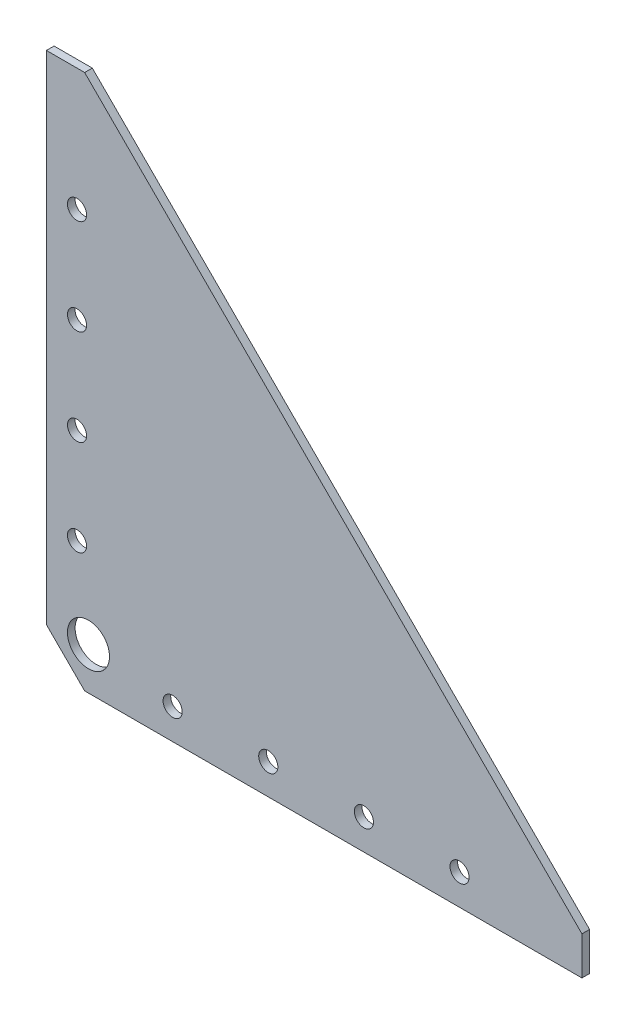
ISO-10303-21;
HEADER;
FILE_DESCRIPTION(('STEP AP214'),'2;1');
FILE_NAME('part.step','',(''),(''),'','','');
FILE_SCHEMA(('AUTOMOTIVE_DESIGN { 1 0 10303 214 1 1 1 1 }'));
ENDSEC;
DATA;
#1=APPLICATION_CONTEXT('core data for automotive mechanical design processes');
#2=APPLICATION_PROTOCOL_DEFINITION('international standard','automotive_design',2000,#1);
#3=PRODUCT_CONTEXT('',#1,'mechanical');
#4=PRODUCT('Part','Part','',(#3));
#5=PRODUCT_RELATED_PRODUCT_CATEGORY('part','',(#4));
#6=PRODUCT_DEFINITION_FORMATION('','',#4);
#7=PRODUCT_DEFINITION_CONTEXT('part definition',#1,'design');
#8=PRODUCT_DEFINITION('design','',#6,#7);
#9=PRODUCT_DEFINITION_SHAPE('','',#8);
#10=(LENGTH_UNIT() NAMED_UNIT(*) SI_UNIT(.MILLI.,.METRE.));
#11=(NAMED_UNIT(*) PLANE_ANGLE_UNIT() SI_UNIT($,.RADIAN.));
#12=(NAMED_UNIT(*) SI_UNIT($,.STERADIAN.) SOLID_ANGLE_UNIT());
#13=UNCERTAINTY_MEASURE_WITH_UNIT(LENGTH_MEASURE(1.E-05),#10,'distance_accuracy_value','');
#14=(GEOMETRIC_REPRESENTATION_CONTEXT(3) GLOBAL_UNCERTAINTY_ASSIGNED_CONTEXT((#13)) GLOBAL_UNIT_ASSIGNED_CONTEXT((#10,
#11,#12)) REPRESENTATION_CONTEXT('',''));
#15=CARTESIAN_POINT('',(0.,0.,0.));
#16=DIRECTION('',(0.,0.,1.));
#17=DIRECTION('',(1.,0.,0.));
#18=AXIS2_PLACEMENT_3D('',#15,#16,#17);
#19=CARTESIAN_POINT('',(0.,140.,-2.));
#20=DIRECTION('',(-1.,0.,0.));
#21=DIRECTION('',(0.,-1.,0.));
#22=AXIS2_PLACEMENT_3D('',#19,#20,#21);
#23=PLANE('',#22);
#24=DIRECTION('',(0.,-1.,0.));
#25=VECTOR('',#24,1.);
#26=CARTESIAN_POINT('',(0.,140.,-2.));
#27=LINE('',#26,#25);
#28=CARTESIAN_POINT('',(0.,140.,-2.));
#29=VERTEX_POINT('',#28);
#30=CARTESIAN_POINT('',(0.,9.99999999999999,-2.));
#31=VERTEX_POINT('',#30);
#32=EDGE_CURVE('E126',#29,#31,#27,.T.);
#33=ORIENTED_EDGE('',*,*,#32,.T.);
#34=DIRECTION('',(0.,0.,1.));
#35=VECTOR('',#34,1.);
#36=CARTESIAN_POINT('',(0.,9.99999999999999,-2.));
#37=LINE('',#36,#35);
#38=CARTESIAN_POINT('',(0.,9.99999999999999,0.));
#39=VERTEX_POINT('',#38);
#40=EDGE_CURVE('E116',#31,#39,#37,.T.);
#41=ORIENTED_EDGE('',*,*,#40,.T.);
#42=DIRECTION('',(0.,-1.,0.));
#43=VECTOR('',#42,1.);
#44=CARTESIAN_POINT('',(0.,140.,0.));
#45=LINE('',#44,#43);
#46=CARTESIAN_POINT('',(0.,140.,0.));
#47=VERTEX_POINT('',#46);
#48=EDGE_CURVE('E145',#47,#39,#45,.T.);
#49=ORIENTED_EDGE('',*,*,#48,.F.);
#50=DIRECTION('',(0.,0.,1.));
#51=VECTOR('',#50,1.);
#52=CARTESIAN_POINT('',(0.,140.,-2.));
#53=LINE('',#52,#51);
#54=EDGE_CURVE('E12',#29,#47,#53,.T.);
#55=ORIENTED_EDGE('',*,*,#54,.F.);
#56=EDGE_LOOP('',(#33,#41,#49,#55));
#57=FACE_BOUND('',#56,.T.);
#58=ADVANCED_FACE('F57',(#57),#23,.T.);
#59=CARTESIAN_POINT('',(0.,0.,-2.));
#60=DIRECTION('',(0.,-1.,0.));
#61=DIRECTION('',(0.,0.,-1.));
#62=AXIS2_PLACEMENT_3D('',#59,#60,#61);
#63=PLANE('',#62);
#64=DIRECTION('',(1.,0.,0.));
#65=VECTOR('',#64,1.);
#66=CARTESIAN_POINT('',(0.,0.,0.));
#67=LINE('',#66,#65);
#68=CARTESIAN_POINT('',(10.,0.,0.));
#69=VERTEX_POINT('',#68);
#70=CARTESIAN_POINT('',(140.,0.,0.));
#71=VERTEX_POINT('',#70);
#72=EDGE_CURVE('E147',#69,#71,#67,.T.);
#73=ORIENTED_EDGE('',*,*,#72,.F.);
#74=DIRECTION('',(0.,0.,1.));
#75=VECTOR('',#74,1.);
#76=CARTESIAN_POINT('',(10.,0.,-2.));
#77=LINE('',#76,#75);
#78=CARTESIAN_POINT('',(10.,0.,-2.));
#79=VERTEX_POINT('',#78);
#80=EDGE_CURVE('E73',#79,#69,#77,.T.);
#81=ORIENTED_EDGE('',*,*,#80,.F.);
#82=DIRECTION('',(1.,0.,0.));
#83=VECTOR('',#82,1.);
#84=CARTESIAN_POINT('',(0.,0.,-2.));
#85=LINE('',#84,#83);
#86=CARTESIAN_POINT('',(140.,0.,-2.));
#87=VERTEX_POINT('',#86);
#88=EDGE_CURVE('E106',#79,#87,#85,.T.);
#89=ORIENTED_EDGE('',*,*,#88,.T.);
#90=DIRECTION('',(0.,0.,1.));
#91=VECTOR('',#90,1.);
#92=CARTESIAN_POINT('',(140.,0.,-2.));
#93=LINE('',#92,#91);
#94=EDGE_CURVE('E60',#87,#71,#93,.T.);
#95=ORIENTED_EDGE('',*,*,#94,.T.);
#96=EDGE_LOOP('',(#73,#81,#89,#95));
#97=FACE_BOUND('',#96,.T.);
#98=ADVANCED_FACE('F159',(#97),#63,.T.);
#99=CARTESIAN_POINT('',(0.,0.,-2.));
#100=DIRECTION('',(0.,0.,1.));
#101=DIRECTION('',(1.,0.,0.));
#102=AXIS2_PLACEMENT_3D('',#99,#100,#101);
#103=PLANE('',#102);
#104=CARTESIAN_POINT('',(108.,8.,-2.));
#105=DIRECTION('',(0.,0.,1.));
#106=DIRECTION('',(1.,0.,0.));
#107=AXIS2_PLACEMENT_3D('',#104,#105,#106);
#108=CIRCLE('',#107,2.5);
#109=CARTESIAN_POINT('',(110.5,8.,-2.));
#110=VERTEX_POINT('',#109);
#111=EDGE_CURVE('E169',#110,#110,#108,.T.);
#112=ORIENTED_EDGE('',*,*,#111,.T.);
#113=EDGE_LOOP('',(#112));
#114=FACE_BOUND('',#113,.T.);
#115=CARTESIAN_POINT('',(11.,11.,-2.));
#116=DIRECTION('',(0.,0.,1.));
#117=DIRECTION('',(1.,0.,0.));
#118=AXIS2_PLACEMENT_3D('',#115,#116,#117);
#119=CIRCLE('',#118,5.5);
#120=CARTESIAN_POINT('',(16.5,11.,-2.));
#121=VERTEX_POINT('',#120);
#122=EDGE_CURVE('E166',#121,#121,#119,.T.);
#123=ORIENTED_EDGE('',*,*,#122,.T.);
#124=EDGE_LOOP('',(#123));
#125=FACE_BOUND('',#124,.T.);
#126=CARTESIAN_POINT('',(7.99999999999999,33.,-2.));
#127=DIRECTION('',(0.,0.,1.));
#128=DIRECTION('',(1.,0.,0.));
#129=AXIS2_PLACEMENT_3D('',#126,#127,#128);
#130=CIRCLE('',#129,2.5);
#131=CARTESIAN_POINT('',(10.5,33.,-2.));
#132=VERTEX_POINT('',#131);
#133=EDGE_CURVE('E189',#132,#132,#130,.T.);
#134=ORIENTED_EDGE('',*,*,#133,.T.);
#135=EDGE_LOOP('',(#134));
#136=FACE_BOUND('',#135,.T.);
#137=CARTESIAN_POINT('',(33.,8.,-2.));
#138=DIRECTION('',(0.,0.,1.));
#139=DIRECTION('',(1.,0.,0.));
#140=AXIS2_PLACEMENT_3D('',#137,#138,#139);
#141=CIRCLE('',#140,2.5);
#142=CARTESIAN_POINT('',(35.5,8.,-2.));
#143=VERTEX_POINT('',#142);
#144=EDGE_CURVE('E183',#143,#143,#141,.T.);
#145=ORIENTED_EDGE('',*,*,#144,.T.);
#146=EDGE_LOOP('',(#145));
#147=FACE_BOUND('',#146,.T.);
#148=CARTESIAN_POINT('',(58.,8.,-2.));
#149=DIRECTION('',(0.,0.,1.));
#150=DIRECTION('',(1.,0.,0.));
#151=AXIS2_PLACEMENT_3D('',#148,#149,#150);
#152=CIRCLE('',#151,2.5);
#153=CARTESIAN_POINT('',(60.5,8.,-2.));
#154=VERTEX_POINT('',#153);
#155=EDGE_CURVE('E176',#154,#154,#152,.T.);
#156=ORIENTED_EDGE('',*,*,#155,.T.);
#157=EDGE_LOOP('',(#156));
#158=FACE_BOUND('',#157,.T.);
#159=CARTESIAN_POINT('',(83.,8.,-2.));
#160=DIRECTION('',(0.,0.,1.));
#161=DIRECTION('',(1.,0.,0.));
#162=AXIS2_PLACEMENT_3D('',#159,#160,#161);
#163=CIRCLE('',#162,2.5);
#164=CARTESIAN_POINT('',(85.5,8.,-2.));
#165=VERTEX_POINT('',#164);
#166=EDGE_CURVE('E214',#165,#165,#163,.T.);
#167=ORIENTED_EDGE('',*,*,#166,.T.);
#168=EDGE_LOOP('',(#167));
#169=FACE_BOUND('',#168,.T.);
#170=CARTESIAN_POINT('',(7.99999999999998,58.,-2.));
#171=DIRECTION('',(0.,0.,1.));
#172=DIRECTION('',(1.,0.,0.));
#173=AXIS2_PLACEMENT_3D('',#170,#171,#172);
#174=CIRCLE('',#173,2.5);
#175=CARTESIAN_POINT('',(10.5,58.,-2.));
#176=VERTEX_POINT('',#175);
#177=EDGE_CURVE('E208',#176,#176,#174,.T.);
#178=ORIENTED_EDGE('',*,*,#177,.T.);
#179=EDGE_LOOP('',(#178));
#180=FACE_BOUND('',#179,.T.);
#181=CARTESIAN_POINT('',(7.99999999999998,108.,-2.));
#182=DIRECTION('',(0.,0.,1.));
#183=DIRECTION('',(1.,0.,0.));
#184=AXIS2_PLACEMENT_3D('',#181,#182,#183);
#185=CIRCLE('',#184,2.5);
#186=CARTESIAN_POINT('',(10.5,108.,-2.));
#187=VERTEX_POINT('',#186);
#188=EDGE_CURVE('E202',#187,#187,#185,.T.);
#189=ORIENTED_EDGE('',*,*,#188,.T.);
#190=EDGE_LOOP('',(#189));
#191=FACE_BOUND('',#190,.T.);
#192=CARTESIAN_POINT('',(7.99999999999998,83.,-2.));
#193=DIRECTION('',(0.,0.,1.));
#194=DIRECTION('',(1.,0.,0.));
#195=AXIS2_PLACEMENT_3D('',#192,#193,#194);
#196=CIRCLE('',#195,2.5);
#197=CARTESIAN_POINT('',(10.5,83.,-2.));
#198=VERTEX_POINT('',#197);
#199=EDGE_CURVE('E175',#198,#198,#196,.T.);
#200=ORIENTED_EDGE('',*,*,#199,.T.);
#201=EDGE_LOOP('',(#200));
#202=FACE_BOUND('',#201,.T.);
#203=DIRECTION('',(0.707106781186549,-0.707106781186546,0.));
#204=VECTOR('',#203,1.);
#205=CARTESIAN_POINT('',(4.99999999999999,5.00000000000001,-2.));
#206=LINE('',#205,#204);
#207=EDGE_CURVE('E119',#31,#79,#206,.T.);
#208=ORIENTED_EDGE('',*,*,#207,.F.);
#209=ORIENTED_EDGE('',*,*,#32,.F.);
#210=DIRECTION('',(-1.,0.,0.));
#211=VECTOR('',#210,1.);
#212=CARTESIAN_POINT('',(10.,140.,-2.));
#213=LINE('',#212,#211);
#214=CARTESIAN_POINT('',(10.,140.,-2.));
#215=VERTEX_POINT('',#214);
#216=EDGE_CURVE('E143',#215,#29,#213,.T.);
#217=ORIENTED_EDGE('',*,*,#216,.F.);
#218=DIRECTION('',(-0.707106781186551,0.707106781186543,0.));
#219=VECTOR('',#218,1.);
#220=CARTESIAN_POINT('',(140.,10.0000000000015,-2.));
#221=LINE('',#220,#219);
#222=CARTESIAN_POINT('',(140.,10.0000000000015,-2.));
#223=VERTEX_POINT('',#222);
#224=EDGE_CURVE('E140',#223,#215,#221,.T.);
#225=ORIENTED_EDGE('',*,*,#224,.F.);
#226=DIRECTION('',(0.,1.,0.));
#227=VECTOR('',#226,1.);
#228=CARTESIAN_POINT('',(140.,0.,-2.));
#229=LINE('',#228,#227);
#230=EDGE_CURVE('E131',#87,#223,#229,.T.);
#231=ORIENTED_EDGE('',*,*,#230,.F.);
#232=ORIENTED_EDGE('',*,*,#88,.F.);
#233=EDGE_LOOP('',(#208,#209,#217,#225,#231,#232));
#234=FACE_BOUND('',#233,.T.);
#235=ADVANCED_FACE('F124',(#114,#125,#136,#147,#158,#169,#180,#191,#202,#234),#103,.F.);
#236=CARTESIAN_POINT('',(0.,0.,0.));
#237=DIRECTION('',(0.,0.,1.));
#238=DIRECTION('',(1.,0.,0.));
#239=AXIS2_PLACEMENT_3D('',#236,#237,#238);
#240=PLANE('',#239);
#241=CARTESIAN_POINT('',(108.,8.,0.));
#242=DIRECTION('',(0.,0.,1.));
#243=DIRECTION('',(1.,0.,0.));
#244=AXIS2_PLACEMENT_3D('',#241,#242,#243);
#245=CIRCLE('',#244,2.5);
#246=CARTESIAN_POINT('',(110.5,8.,0.));
#247=VERTEX_POINT('',#246);
#248=EDGE_CURVE('E172',#247,#247,#245,.T.);
#249=ORIENTED_EDGE('',*,*,#248,.F.);
#250=EDGE_LOOP('',(#249));
#251=FACE_BOUND('',#250,.T.);
#252=CARTESIAN_POINT('',(11.,11.,0.));
#253=DIRECTION('',(0.,0.,1.));
#254=DIRECTION('',(1.,0.,0.));
#255=AXIS2_PLACEMENT_3D('',#252,#253,#254);
#256=CIRCLE('',#255,5.5);
#257=CARTESIAN_POINT('',(16.5,11.,0.));
#258=VERTEX_POINT('',#257);
#259=EDGE_CURVE('E163',#258,#258,#256,.T.);
#260=ORIENTED_EDGE('',*,*,#259,.F.);
#261=EDGE_LOOP('',(#260));
#262=FACE_BOUND('',#261,.T.);
#263=CARTESIAN_POINT('',(7.99999999999999,33.,0.));
#264=DIRECTION('',(0.,0.,1.));
#265=DIRECTION('',(1.,0.,0.));
#266=AXIS2_PLACEMENT_3D('',#263,#264,#265);
#267=CIRCLE('',#266,2.5);
#268=CARTESIAN_POINT('',(10.5,33.,0.));
#269=VERTEX_POINT('',#268);
#270=EDGE_CURVE('E192',#269,#269,#267,.T.);
#271=ORIENTED_EDGE('',*,*,#270,.F.);
#272=EDGE_LOOP('',(#271));
#273=FACE_BOUND('',#272,.T.);
#274=CARTESIAN_POINT('',(33.,8.,0.));
#275=DIRECTION('',(0.,0.,1.));
#276=DIRECTION('',(1.,0.,0.));
#277=AXIS2_PLACEMENT_3D('',#274,#275,#276);
#278=CIRCLE('',#277,2.5);
#279=CARTESIAN_POINT('',(35.5,8.,0.));
#280=VERTEX_POINT('',#279);
#281=EDGE_CURVE('E186',#280,#280,#278,.T.);
#282=ORIENTED_EDGE('',*,*,#281,.F.);
#283=EDGE_LOOP('',(#282));
#284=FACE_BOUND('',#283,.T.);
#285=CARTESIAN_POINT('',(58.,8.,0.));
#286=DIRECTION('',(0.,0.,1.));
#287=DIRECTION('',(1.,0.,0.));
#288=AXIS2_PLACEMENT_3D('',#285,#286,#287);
#289=CIRCLE('',#288,2.5);
#290=CARTESIAN_POINT('',(60.5,8.,0.));
#291=VERTEX_POINT('',#290);
#292=EDGE_CURVE('E179',#291,#291,#289,.T.);
#293=ORIENTED_EDGE('',*,*,#292,.F.);
#294=EDGE_LOOP('',(#293));
#295=FACE_BOUND('',#294,.T.);
#296=CARTESIAN_POINT('',(83.,8.,0.));
#297=DIRECTION('',(0.,0.,1.));
#298=DIRECTION('',(1.,0.,0.));
#299=AXIS2_PLACEMENT_3D('',#296,#297,#298);
#300=CIRCLE('',#299,2.5);
#301=CARTESIAN_POINT('',(85.5,8.,0.));
#302=VERTEX_POINT('',#301);
#303=EDGE_CURVE('E180',#302,#302,#300,.T.);
#304=ORIENTED_EDGE('',*,*,#303,.F.);
#305=EDGE_LOOP('',(#304));
#306=FACE_BOUND('',#305,.T.);
#307=CARTESIAN_POINT('',(7.99999999999998,58.,0.));
#308=DIRECTION('',(0.,0.,1.));
#309=DIRECTION('',(1.,0.,0.));
#310=AXIS2_PLACEMENT_3D('',#307,#308,#309);
#311=CIRCLE('',#310,2.5);
#312=CARTESIAN_POINT('',(10.5,58.,0.));
#313=VERTEX_POINT('',#312);
#314=EDGE_CURVE('E211',#313,#313,#311,.T.);
#315=ORIENTED_EDGE('',*,*,#314,.F.);
#316=EDGE_LOOP('',(#315));
#317=FACE_BOUND('',#316,.T.);
#318=CARTESIAN_POINT('',(7.99999999999998,108.,0.));
#319=DIRECTION('',(0.,0.,1.));
#320=DIRECTION('',(1.,0.,0.));
#321=AXIS2_PLACEMENT_3D('',#318,#319,#320);
#322=CIRCLE('',#321,2.5);
#323=CARTESIAN_POINT('',(10.5,108.,0.));
#324=VERTEX_POINT('',#323);
#325=EDGE_CURVE('E205',#324,#324,#322,.T.);
#326=ORIENTED_EDGE('',*,*,#325,.F.);
#327=EDGE_LOOP('',(#326));
#328=FACE_BOUND('',#327,.T.);
#329=CARTESIAN_POINT('',(7.99999999999998,83.,0.));
#330=DIRECTION('',(0.,0.,1.));
#331=DIRECTION('',(1.,0.,0.));
#332=AXIS2_PLACEMENT_3D('',#329,#330,#331);
#333=CIRCLE('',#332,2.5);
#334=CARTESIAN_POINT('',(10.5,83.,0.));
#335=VERTEX_POINT('',#334);
#336=EDGE_CURVE('E199',#335,#335,#333,.T.);
#337=ORIENTED_EDGE('',*,*,#336,.F.);
#338=EDGE_LOOP('',(#337));
#339=FACE_BOUND('',#338,.T.);
#340=ORIENTED_EDGE('',*,*,#48,.T.);
#341=DIRECTION('',(0.707106781186549,-0.707106781186546,0.));
#342=VECTOR('',#341,1.);
#343=CARTESIAN_POINT('',(4.99999999999999,5.00000000000001,0.));
#344=LINE('',#343,#342);
#345=EDGE_CURVE('E120',#39,#69,#344,.T.);
#346=ORIENTED_EDGE('',*,*,#345,.T.);
#347=ORIENTED_EDGE('',*,*,#72,.T.);
#348=DIRECTION('',(0.,1.,0.));
#349=VECTOR('',#348,1.);
#350=CARTESIAN_POINT('',(140.,0.,0.));
#351=LINE('',#350,#349);
#352=CARTESIAN_POINT('',(140.,10.0000000000015,0.));
#353=VERTEX_POINT('',#352);
#354=EDGE_CURVE('E149',#71,#353,#351,.T.);
#355=ORIENTED_EDGE('',*,*,#354,.T.);
#356=DIRECTION('',(-0.707106781186551,0.707106781186543,0.));
#357=VECTOR('',#356,1.);
#358=CARTESIAN_POINT('',(140.,10.0000000000015,0.));
#359=LINE('',#358,#357);
#360=CARTESIAN_POINT('',(10.,140.,0.));
#361=VERTEX_POINT('',#360);
#362=EDGE_CURVE('E134',#353,#361,#359,.T.);
#363=ORIENTED_EDGE('',*,*,#362,.T.);
#364=DIRECTION('',(-1.,0.,0.));
#365=VECTOR('',#364,1.);
#366=CARTESIAN_POINT('',(10.,140.,0.));
#367=LINE('',#366,#365);
#368=EDGE_CURVE('E129',#361,#47,#367,.T.);
#369=ORIENTED_EDGE('',*,*,#368,.T.);
#370=EDGE_LOOP('',(#340,#346,#347,#355,#363,#369));
#371=FACE_BOUND('',#370,.T.);
#372=ADVANCED_FACE('F162',(#251,#262,#273,#284,#295,#306,#317,#328,#339,#371),#240,.T.);
#373=CARTESIAN_POINT('',(10.,140.,-2.));
#374=DIRECTION('',(0.,1.,0.));
#375=DIRECTION('',(-1.,0.,0.));
#376=AXIS2_PLACEMENT_3D('',#373,#374,#375);
#377=PLANE('',#376);
#378=ORIENTED_EDGE('',*,*,#368,.F.);
#379=DIRECTION('',(0.,0.,1.));
#380=VECTOR('',#379,1.);
#381=CARTESIAN_POINT('',(10.,140.,-2.));
#382=LINE('',#381,#380);
#383=EDGE_CURVE('E65',#215,#361,#382,.T.);
#384=ORIENTED_EDGE('',*,*,#383,.F.);
#385=ORIENTED_EDGE('',*,*,#216,.T.);
#386=ORIENTED_EDGE('',*,*,#54,.T.);
#387=EDGE_LOOP('',(#378,#384,#385,#386));
#388=FACE_BOUND('',#387,.T.);
#389=ADVANCED_FACE('F224',(#388),#377,.T.);
#390=CARTESIAN_POINT('',(140.,10.0000000000015,-2.));
#391=DIRECTION('',(0.707106781186544,0.707106781186552,0.));
#392=DIRECTION('',(-0.707106781186551,0.707106781186544,0.));
#393=AXIS2_PLACEMENT_3D('',#390,#391,#392);
#394=PLANE('',#393);
#395=ORIENTED_EDGE('',*,*,#362,.F.);
#396=DIRECTION('',(0.,0.,1.));
#397=VECTOR('',#396,1.);
#398=CARTESIAN_POINT('',(140.,10.0000000000015,-2.));
#399=LINE('',#398,#397);
#400=EDGE_CURVE('E154',#223,#353,#399,.T.);
#401=ORIENTED_EDGE('',*,*,#400,.F.);
#402=ORIENTED_EDGE('',*,*,#224,.T.);
#403=ORIENTED_EDGE('',*,*,#383,.T.);
#404=EDGE_LOOP('',(#395,#401,#402,#403));
#405=FACE_BOUND('',#404,.T.);
#406=ADVANCED_FACE('F260',(#405),#394,.T.);
#407=CARTESIAN_POINT('',(140.,0.,-2.));
#408=DIRECTION('',(1.,0.,0.));
#409=DIRECTION('',(0.,1.,0.));
#410=AXIS2_PLACEMENT_3D('',#407,#408,#409);
#411=PLANE('',#410);
#412=ORIENTED_EDGE('',*,*,#354,.F.);
#413=ORIENTED_EDGE('',*,*,#94,.F.);
#414=ORIENTED_EDGE('',*,*,#230,.T.);
#415=ORIENTED_EDGE('',*,*,#400,.T.);
#416=EDGE_LOOP('',(#412,#413,#414,#415));
#417=FACE_BOUND('',#416,.T.);
#418=ADVANCED_FACE('F160',(#417),#411,.T.);
#419=CARTESIAN_POINT('',(4.99999999999999,5.00000000000001,-2.));
#420=DIRECTION('',(-0.707106781186546,-0.707106781186549,0.));
#421=DIRECTION('',(0.707106781186549,-0.707106781186546,0.));
#422=AXIS2_PLACEMENT_3D('',#419,#420,#421);
#423=PLANE('',#422);
#424=ORIENTED_EDGE('',*,*,#345,.F.);
#425=ORIENTED_EDGE('',*,*,#40,.F.);
#426=ORIENTED_EDGE('',*,*,#207,.T.);
#427=ORIENTED_EDGE('',*,*,#80,.T.);
#428=EDGE_LOOP('',(#424,#425,#426,#427));
#429=FACE_BOUND('',#428,.T.);
#430=ADVANCED_FACE('F118',(#429),#423,.T.);
#431=CARTESIAN_POINT('',(7.99999999999998,83.,-2.));
#432=DIRECTION('',(0.,0.,1.));
#433=DIRECTION('',(1.,0.,0.));
#434=AXIS2_PLACEMENT_3D('',#431,#432,#433);
#435=CYLINDRICAL_SURFACE('',#434,2.5);
#436=ORIENTED_EDGE('',*,*,#199,.F.);
#437=EDGE_LOOP('',(#436));
#438=FACE_BOUND('',#437,.T.);
#439=ORIENTED_EDGE('',*,*,#336,.T.);
#440=EDGE_LOOP('',(#439));
#441=FACE_BOUND('',#440,.T.);
#442=ADVANCED_FACE('F233',(#438,#441),#435,.F.);
#443=CARTESIAN_POINT('',(7.99999999999998,108.,-2.));
#444=DIRECTION('',(0.,0.,1.));
#445=DIRECTION('',(1.,0.,0.));
#446=AXIS2_PLACEMENT_3D('',#443,#444,#445);
#447=CYLINDRICAL_SURFACE('',#446,2.5);
#448=ORIENTED_EDGE('',*,*,#188,.F.);
#449=EDGE_LOOP('',(#448));
#450=FACE_BOUND('',#449,.T.);
#451=ORIENTED_EDGE('',*,*,#325,.T.);
#452=EDGE_LOOP('',(#451));
#453=FACE_BOUND('',#452,.T.);
#454=ADVANCED_FACE('F235',(#450,#453),#447,.F.);
#455=CARTESIAN_POINT('',(7.99999999999998,58.,-2.));
#456=DIRECTION('',(0.,0.,1.));
#457=DIRECTION('',(1.,0.,0.));
#458=AXIS2_PLACEMENT_3D('',#455,#456,#457);
#459=CYLINDRICAL_SURFACE('',#458,2.5);
#460=ORIENTED_EDGE('',*,*,#177,.F.);
#461=EDGE_LOOP('',(#460));
#462=FACE_BOUND('',#461,.T.);
#463=ORIENTED_EDGE('',*,*,#314,.T.);
#464=EDGE_LOOP('',(#463));
#465=FACE_BOUND('',#464,.T.);
#466=ADVANCED_FACE('F242',(#462,#465),#459,.F.);
#467=CARTESIAN_POINT('',(83.,8.,-2.));
#468=DIRECTION('',(0.,0.,1.));
#469=DIRECTION('',(1.,0.,0.));
#470=AXIS2_PLACEMENT_3D('',#467,#468,#469);
#471=CYLINDRICAL_SURFACE('',#470,2.5);
#472=ORIENTED_EDGE('',*,*,#166,.F.);
#473=EDGE_LOOP('',(#472));
#474=FACE_BOUND('',#473,.T.);
#475=ORIENTED_EDGE('',*,*,#303,.T.);
#476=EDGE_LOOP('',(#475));
#477=FACE_BOUND('',#476,.T.);
#478=ADVANCED_FACE('F220',(#474,#477),#471,.F.);
#479=CARTESIAN_POINT('',(58.,8.,-2.));
#480=DIRECTION('',(0.,0.,1.));
#481=DIRECTION('',(1.,0.,0.));
#482=AXIS2_PLACEMENT_3D('',#479,#480,#481);
#483=CYLINDRICAL_SURFACE('',#482,2.5);
#484=ORIENTED_EDGE('',*,*,#155,.F.);
#485=EDGE_LOOP('',(#484));
#486=FACE_BOUND('',#485,.T.);
#487=ORIENTED_EDGE('',*,*,#292,.T.);
#488=EDGE_LOOP('',(#487));
#489=FACE_BOUND('',#488,.T.);
#490=ADVANCED_FACE('F271',(#486,#489),#483,.F.);
#491=CARTESIAN_POINT('',(33.,8.,-2.));
#492=DIRECTION('',(0.,0.,1.));
#493=DIRECTION('',(1.,0.,0.));
#494=AXIS2_PLACEMENT_3D('',#491,#492,#493);
#495=CYLINDRICAL_SURFACE('',#494,2.5);
#496=ORIENTED_EDGE('',*,*,#144,.F.);
#497=EDGE_LOOP('',(#496));
#498=FACE_BOUND('',#497,.T.);
#499=ORIENTED_EDGE('',*,*,#281,.T.);
#500=EDGE_LOOP('',(#499));
#501=FACE_BOUND('',#500,.T.);
#502=ADVANCED_FACE('F274',(#498,#501),#495,.F.);
#503=CARTESIAN_POINT('',(7.99999999999999,33.,-2.));
#504=DIRECTION('',(0.,0.,1.));
#505=DIRECTION('',(1.,0.,0.));
#506=AXIS2_PLACEMENT_3D('',#503,#504,#505);
#507=CYLINDRICAL_SURFACE('',#506,2.5);
#508=ORIENTED_EDGE('',*,*,#133,.F.);
#509=EDGE_LOOP('',(#508));
#510=FACE_BOUND('',#509,.T.);
#511=ORIENTED_EDGE('',*,*,#270,.T.);
#512=EDGE_LOOP('',(#511));
#513=FACE_BOUND('',#512,.T.);
#514=ADVANCED_FACE('F278',(#510,#513),#507,.F.);
#515=CARTESIAN_POINT('',(11.,11.,-2.));
#516=DIRECTION('',(0.,0.,1.));
#517=DIRECTION('',(1.,0.,0.));
#518=AXIS2_PLACEMENT_3D('',#515,#516,#517);
#519=CYLINDRICAL_SURFACE('',#518,5.5);
#520=ORIENTED_EDGE('',*,*,#122,.F.);
#521=EDGE_LOOP('',(#520));
#522=FACE_BOUND('',#521,.T.);
#523=ORIENTED_EDGE('',*,*,#259,.T.);
#524=EDGE_LOOP('',(#523));
#525=FACE_BOUND('',#524,.T.);
#526=ADVANCED_FACE('F269',(#522,#525),#519,.F.);
#527=CARTESIAN_POINT('',(108.,8.,-2.));
#528=DIRECTION('',(0.,0.,1.));
#529=DIRECTION('',(1.,0.,0.));
#530=AXIS2_PLACEMENT_3D('',#527,#528,#529);
#531=CYLINDRICAL_SURFACE('',#530,2.5);
#532=ORIENTED_EDGE('',*,*,#111,.F.);
#533=EDGE_LOOP('',(#532));
#534=FACE_BOUND('',#533,.T.);
#535=ORIENTED_EDGE('',*,*,#248,.T.);
#536=EDGE_LOOP('',(#535));
#537=FACE_BOUND('',#536,.T.);
#538=ADVANCED_FACE('F266',(#534,#537),#531,.F.);
#539=CLOSED_SHELL('',(#58,#98,#235,#372,#389,#406,#418,#430,#442,#454,#466,#478,#490,#502,#514,
#526,#538));
#540=MANIFOLD_SOLID_BREP('B2',#539);
#541=ADVANCED_BREP_SHAPE_REPRESENTATION('',(#18,#540),#14);
#542=SHAPE_DEFINITION_REPRESENTATION(#9,#541);
ENDSEC;
END-ISO-10303-21;
